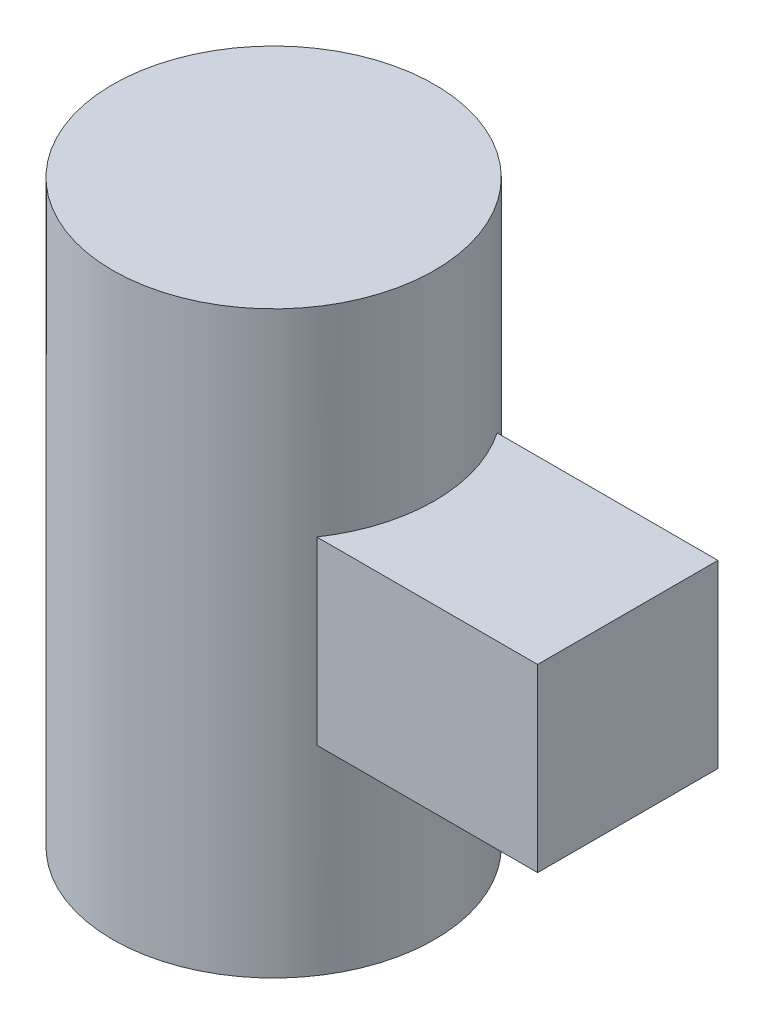
ISO-10303-21;
HEADER;
FILE_DESCRIPTION(('STEP AP214'),'2;1');
FILE_NAME('part.step','',(''),(''),'','','');
FILE_SCHEMA(('AUTOMOTIVE_DESIGN { 1 0 10303 214 1 1 1 1 }'));
ENDSEC;
DATA;
#1=APPLICATION_CONTEXT('core data for automotive mechanical design processes');
#2=APPLICATION_PROTOCOL_DEFINITION('international standard','automotive_design',2000,#1);
#3=PRODUCT_CONTEXT('',#1,'mechanical');
#4=PRODUCT('Part','Part','',(#3));
#5=PRODUCT_RELATED_PRODUCT_CATEGORY('part','',(#4));
#6=PRODUCT_DEFINITION_FORMATION('','',#4);
#7=PRODUCT_DEFINITION_CONTEXT('part definition',#1,'design');
#8=PRODUCT_DEFINITION('design','',#6,#7);
#9=PRODUCT_DEFINITION_SHAPE('','',#8);
#10=(LENGTH_UNIT() NAMED_UNIT(*) SI_UNIT(.MILLI.,.METRE.));
#11=(NAMED_UNIT(*) PLANE_ANGLE_UNIT() SI_UNIT($,.RADIAN.));
#12=(NAMED_UNIT(*) SI_UNIT($,.STERADIAN.) SOLID_ANGLE_UNIT());
#13=UNCERTAINTY_MEASURE_WITH_UNIT(LENGTH_MEASURE(1.E-05),#10,'distance_accuracy_value','');
#14=(GEOMETRIC_REPRESENTATION_CONTEXT(3) GLOBAL_UNCERTAINTY_ASSIGNED_CONTEXT((#13)) GLOBAL_UNIT_ASSIGNED_CONTEXT((#10,
#11,#12)) REPRESENTATION_CONTEXT('',''));
#15=CARTESIAN_POINT('',(0.,0.,0.));
#16=DIRECTION('',(0.,0.,1.));
#17=DIRECTION('',(1.,0.,0.));
#18=AXIS2_PLACEMENT_3D('',#15,#16,#17);
#19=CARTESIAN_POINT('',(0.,57.15,0.));
#20=DIRECTION('',(0.,-1.,0.));
#21=DIRECTION('',(0.,0.,-1.));
#22=AXIS2_PLACEMENT_3D('',#19,#20,#21);
#23=CYLINDRICAL_SURFACE('',#22,31.75);
#24=CARTESIAN_POINT('',(0.,-57.15,0.));
#25=DIRECTION('',(0.,1.,0.));
#26=DIRECTION('',(0.,0.,1.));
#27=AXIS2_PLACEMENT_3D('',#24,#25,#26);
#28=CIRCLE('',#27,31.75);
#29=CARTESIAN_POINT('',(0.,-57.15,31.75));
#30=VERTEX_POINT('',#29);
#31=EDGE_CURVE('E92',#30,#30,#28,.T.);
#32=ORIENTED_EDGE('',*,*,#31,.T.);
#33=EDGE_LOOP('',(#32));
#34=FACE_BOUND('',#33,.T.);
#35=CARTESIAN_POINT('',(0.,57.15,0.));
#36=DIRECTION('',(0.,1.,0.));
#37=DIRECTION('',(0.,0.,1.));
#38=AXIS2_PLACEMENT_3D('',#35,#36,#37);
#39=CIRCLE('',#38,31.75);
#40=CARTESIAN_POINT('',(0.,57.15,31.75));
#41=VERTEX_POINT('',#40);
#42=EDGE_CURVE('E95',#41,#41,#39,.T.);
#43=ORIENTED_EDGE('',*,*,#42,.F.);
#44=EDGE_LOOP('',(#43));
#45=FACE_BOUND('',#44,.T.);
#46=DIRECTION('',(0.,-1.,0.));
#47=VECTOR('',#46,1.);
#48=CARTESIAN_POINT('',(26.3046402750541,57.15,-17.78));
#49=LINE('',#48,#47);
#50=CARTESIAN_POINT('',(26.3046402750541,-17.78,-17.78));
#51=VERTEX_POINT('',#50);
#52=CARTESIAN_POINT('',(26.3046402750541,17.78,-17.78));
#53=VERTEX_POINT('',#52);
#54=EDGE_CURVE('E11',#51,#53,#49,.F.);
#55=ORIENTED_EDGE('',*,*,#54,.F.);
#56=CARTESIAN_POINT('',(0.,-17.78,0.));
#57=DIRECTION('',(0.,1.,0.));
#58=DIRECTION('',(0.,0.,1.));
#59=AXIS2_PLACEMENT_3D('',#56,#57,#58);
#60=CIRCLE('',#59,31.75);
#61=CARTESIAN_POINT('',(26.3046402750541,-17.78,17.78));
#62=VERTEX_POINT('',#61);
#63=EDGE_CURVE('E102',#62,#51,#60,.T.);
#64=ORIENTED_EDGE('',*,*,#63,.F.);
#65=DIRECTION('',(0.,-1.,0.));
#66=VECTOR('',#65,1.);
#67=CARTESIAN_POINT('',(26.3046402750541,57.15,17.78));
#68=LINE('',#67,#66);
#69=CARTESIAN_POINT('',(26.3046402750541,17.78,17.78));
#70=VERTEX_POINT('',#69);
#71=EDGE_CURVE('E52',#70,#62,#68,.T.);
#72=ORIENTED_EDGE('',*,*,#71,.F.);
#73=CARTESIAN_POINT('',(0.,17.78,0.));
#74=DIRECTION('',(0.,-1.,0.));
#75=DIRECTION('',(0.,0.,-1.));
#76=AXIS2_PLACEMENT_3D('',#73,#74,#75);
#77=CIRCLE('',#76,31.75);
#78=EDGE_CURVE('E42',#53,#70,#77,.T.);
#79=ORIENTED_EDGE('',*,*,#78,.F.);
#80=EDGE_LOOP('',(#55,#64,#72,#79));
#81=FACE_BOUND('',#80,.T.);
#82=ADVANCED_FACE('F35',(#34,#45,#81),#23,.T.);
#83=CARTESIAN_POINT('',(0.,57.15,0.));
#84=DIRECTION('',(0.,1.,0.));
#85=DIRECTION('',(0.,0.,1.));
#86=AXIS2_PLACEMENT_3D('',#83,#84,#85);
#87=PLANE('',#86);
#88=ORIENTED_EDGE('',*,*,#42,.T.);
#89=EDGE_LOOP('',(#88));
#90=FACE_BOUND('',#89,.T.);
#91=ADVANCED_FACE('F117',(#90),#87,.T.);
#92=CARTESIAN_POINT('',(0.,-57.15,0.));
#93=DIRECTION('',(0.,1.,0.));
#94=DIRECTION('',(0.,0.,1.));
#95=AXIS2_PLACEMENT_3D('',#92,#93,#94);
#96=PLANE('',#95);
#97=ORIENTED_EDGE('',*,*,#31,.F.);
#98=EDGE_LOOP('',(#97));
#99=FACE_BOUND('',#98,.T.);
#100=ADVANCED_FACE('F122',(#99),#96,.F.);
#101=CARTESIAN_POINT('',(69.85,-17.78,-17.78));
#102=DIRECTION('',(0.,0.,1.));
#103=DIRECTION('',(1.,0.,0.));
#104=AXIS2_PLACEMENT_3D('',#101,#102,#103);
#105=PLANE('',#104);
#106=DIRECTION('',(-1.,0.,0.));
#107=VECTOR('',#106,1.);
#108=CARTESIAN_POINT('',(69.85,-17.78,-17.78));
#109=LINE('',#108,#107);
#110=CARTESIAN_POINT('',(69.85,-17.78,-17.78));
#111=VERTEX_POINT('',#110);
#112=EDGE_CURVE('E111',#111,#51,#109,.T.);
#113=ORIENTED_EDGE('',*,*,#112,.T.);
#114=ORIENTED_EDGE('',*,*,#54,.T.);
#115=DIRECTION('',(-1.,0.,0.));
#116=VECTOR('',#115,1.);
#117=CARTESIAN_POINT('',(69.85,17.78,-17.78));
#118=LINE('',#117,#116);
#119=CARTESIAN_POINT('',(69.85,17.78,-17.78));
#120=VERTEX_POINT('',#119);
#121=EDGE_CURVE('E75',#120,#53,#118,.T.);
#122=ORIENTED_EDGE('',*,*,#121,.F.);
#123=DIRECTION('',(0.,1.,0.));
#124=VECTOR('',#123,1.);
#125=CARTESIAN_POINT('',(69.85,-17.78,-17.78));
#126=LINE('',#125,#124);
#127=EDGE_CURVE('E81',#111,#120,#126,.T.);
#128=ORIENTED_EDGE('',*,*,#127,.F.);
#129=EDGE_LOOP('',(#113,#114,#122,#128));
#130=FACE_BOUND('',#129,.T.);
#131=ADVANCED_FACE('F91',(#130),#105,.F.);
#132=CARTESIAN_POINT('',(69.85,-17.78,17.78));
#133=DIRECTION('',(0.,0.,-1.));
#134=DIRECTION('',(-1.,0.,0.));
#135=AXIS2_PLACEMENT_3D('',#132,#133,#134);
#136=PLANE('',#135);
#137=DIRECTION('',(-1.,0.,0.));
#138=VECTOR('',#137,1.);
#139=CARTESIAN_POINT('',(69.85,17.78,17.78));
#140=LINE('',#139,#138);
#141=CARTESIAN_POINT('',(69.85,17.78,17.78));
#142=VERTEX_POINT('',#141);
#143=EDGE_CURVE('E77',#142,#70,#140,.T.);
#144=ORIENTED_EDGE('',*,*,#143,.T.);
#145=ORIENTED_EDGE('',*,*,#71,.T.);
#146=DIRECTION('',(-1.,0.,0.));
#147=VECTOR('',#146,1.);
#148=CARTESIAN_POINT('',(69.85,-17.78,17.78));
#149=LINE('',#148,#147);
#150=CARTESIAN_POINT('',(69.85,-17.78,17.78));
#151=VERTEX_POINT('',#150);
#152=EDGE_CURVE('E97',#151,#62,#149,.T.);
#153=ORIENTED_EDGE('',*,*,#152,.F.);
#154=DIRECTION('',(0.,-1.,0.));
#155=VECTOR('',#154,1.);
#156=CARTESIAN_POINT('',(69.85,-17.78,17.78));
#157=LINE('',#156,#155);
#158=EDGE_CURVE('E80',#142,#151,#157,.T.);
#159=ORIENTED_EDGE('',*,*,#158,.F.);
#160=EDGE_LOOP('',(#144,#145,#153,#159));
#161=FACE_BOUND('',#160,.T.);
#162=ADVANCED_FACE('F107',(#161),#136,.F.);
#163=CARTESIAN_POINT('',(69.85,17.78,17.78));
#164=DIRECTION('',(0.,-1.,0.));
#165=DIRECTION('',(0.,0.,-1.));
#166=AXIS2_PLACEMENT_3D('',#163,#164,#165);
#167=PLANE('',#166);
#168=ORIENTED_EDGE('',*,*,#121,.T.);
#169=ORIENTED_EDGE('',*,*,#78,.T.);
#170=ORIENTED_EDGE('',*,*,#143,.F.);
#171=DIRECTION('',(0.,0.,1.));
#172=VECTOR('',#171,1.);
#173=CARTESIAN_POINT('',(69.85,17.78,17.78));
#174=LINE('',#173,#172);
#175=EDGE_CURVE('E71',#120,#142,#174,.T.);
#176=ORIENTED_EDGE('',*,*,#175,.F.);
#177=EDGE_LOOP('',(#168,#169,#170,#176));
#178=FACE_BOUND('',#177,.T.);
#179=ADVANCED_FACE('F73',(#178),#167,.F.);
#180=CARTESIAN_POINT('',(69.85,-17.78,17.78));
#181=DIRECTION('',(0.,1.,0.));
#182=DIRECTION('',(0.,0.,1.));
#183=AXIS2_PLACEMENT_3D('',#180,#181,#182);
#184=PLANE('',#183);
#185=ORIENTED_EDGE('',*,*,#152,.T.);
#186=ORIENTED_EDGE('',*,*,#63,.T.);
#187=ORIENTED_EDGE('',*,*,#112,.F.);
#188=DIRECTION('',(0.,0.,-1.));
#189=VECTOR('',#188,1.);
#190=CARTESIAN_POINT('',(69.85,-17.78,17.78));
#191=LINE('',#190,#189);
#192=EDGE_CURVE('E86',#151,#111,#191,.T.);
#193=ORIENTED_EDGE('',*,*,#192,.F.);
#194=EDGE_LOOP('',(#185,#186,#187,#193));
#195=FACE_BOUND('',#194,.T.);
#196=ADVANCED_FACE('F115',(#195),#184,.F.);
#197=CARTESIAN_POINT('',(69.85,0.,0.));
#198=DIRECTION('',(-1.,0.,0.));
#199=DIRECTION('',(0.,0.,1.));
#200=AXIS2_PLACEMENT_3D('',#197,#198,#199);
#201=PLANE('',#200);
#202=ORIENTED_EDGE('',*,*,#127,.T.);
#203=ORIENTED_EDGE('',*,*,#175,.T.);
#204=ORIENTED_EDGE('',*,*,#158,.T.);
#205=ORIENTED_EDGE('',*,*,#192,.T.);
#206=EDGE_LOOP('',(#202,#203,#204,#205));
#207=FACE_BOUND('',#206,.T.);
#208=ADVANCED_FACE('F84',(#207),#201,.F.);
#209=CLOSED_SHELL('',(#82,#91,#100,#131,#162,#179,#196,#208));
#210=MANIFOLD_SOLID_BREP('B2',#209);
#211=ADVANCED_BREP_SHAPE_REPRESENTATION('',(#18,#210),#14);
#212=SHAPE_DEFINITION_REPRESENTATION(#9,#211);
ENDSEC;
END-ISO-10303-21;
